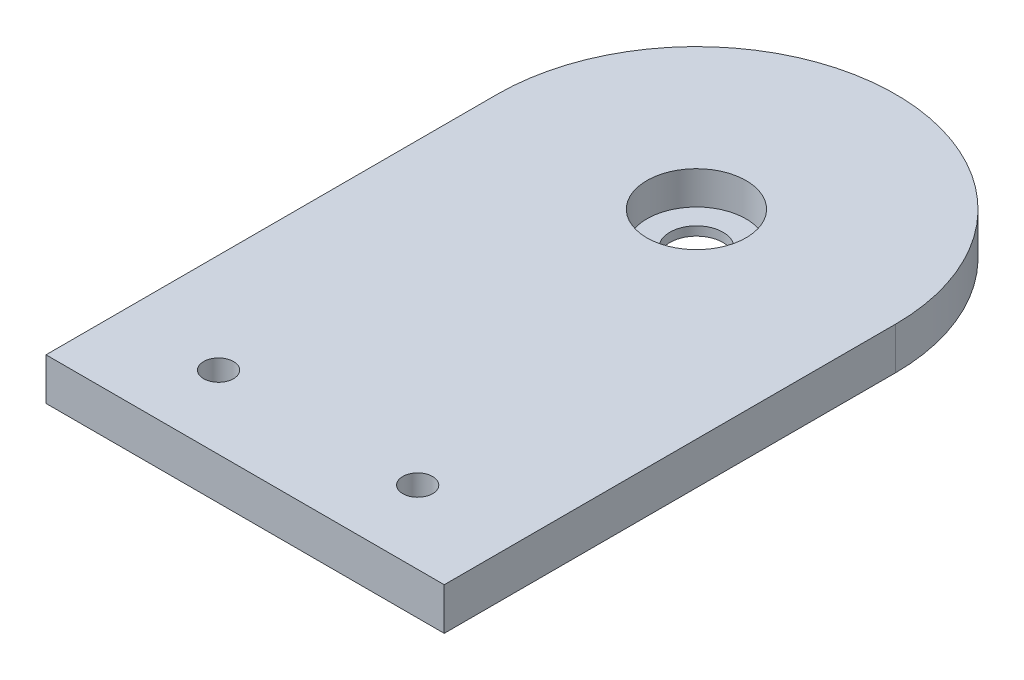
ISO-10303-21;
HEADER;
FILE_DESCRIPTION(('STEP AP214'),'2;1');
FILE_NAME('part.step','',(''),(''),'','','');
FILE_SCHEMA(('AUTOMOTIVE_DESIGN { 1 0 10303 214 1 1 1 1 }'));
ENDSEC;
DATA;
#1=APPLICATION_CONTEXT('core data for automotive mechanical design processes');
#2=APPLICATION_PROTOCOL_DEFINITION('international standard','automotive_design',2000,#1);
#3=PRODUCT_CONTEXT('',#1,'mechanical');
#4=PRODUCT('Part','Part','',(#3));
#5=PRODUCT_RELATED_PRODUCT_CATEGORY('part','',(#4));
#6=PRODUCT_DEFINITION_FORMATION('','',#4);
#7=PRODUCT_DEFINITION_CONTEXT('part definition',#1,'design');
#8=PRODUCT_DEFINITION('design','',#6,#7);
#9=PRODUCT_DEFINITION_SHAPE('','',#8);
#10=(LENGTH_UNIT() NAMED_UNIT(*) SI_UNIT(.MILLI.,.METRE.));
#11=(NAMED_UNIT(*) PLANE_ANGLE_UNIT() SI_UNIT($,.RADIAN.));
#12=(NAMED_UNIT(*) SI_UNIT($,.STERADIAN.) SOLID_ANGLE_UNIT());
#13=UNCERTAINTY_MEASURE_WITH_UNIT(LENGTH_MEASURE(1.E-05),#10,'distance_accuracy_value','');
#14=(GEOMETRIC_REPRESENTATION_CONTEXT(3) GLOBAL_UNCERTAINTY_ASSIGNED_CONTEXT((#13)) GLOBAL_UNIT_ASSIGNED_CONTEXT((#10,
#11,#12)) REPRESENTATION_CONTEXT('',''));
#15=CARTESIAN_POINT('',(0.,0.,0.));
#16=DIRECTION('',(0.,0.,1.));
#17=DIRECTION('',(1.,0.,0.));
#18=AXIS2_PLACEMENT_3D('',#15,#16,#17);
#19=CARTESIAN_POINT('',(30.,-59.75,379.));
#20=DIRECTION('',(-1.,0.,0.));
#21=DIRECTION('',(0.,0.,1.));
#22=AXIS2_PLACEMENT_3D('',#19,#20,#21);
#23=PLANE('',#22);
#24=DIRECTION('',(0.,0.,-1.));
#25=VECTOR('',#24,1.);
#26=CARTESIAN_POINT('',(30.,-66.1,379.));
#27=LINE('',#26,#25);
#28=CARTESIAN_POINT('',(30.,-66.1,398.));
#29=VERTEX_POINT('',#28);
#30=CARTESIAN_POINT('',(30.,-66.1,330.));
#31=VERTEX_POINT('',#30);
#32=EDGE_CURVE('E122',#29,#31,#27,.T.);
#33=ORIENTED_EDGE('',*,*,#32,.T.);
#34=DIRECTION('',(0.,-1.,0.));
#35=VECTOR('',#34,1.);
#36=CARTESIAN_POINT('',(30.,-59.75,330.));
#37=LINE('',#36,#35);
#38=CARTESIAN_POINT('',(30.,-59.75,330.));
#39=VERTEX_POINT('',#38);
#40=EDGE_CURVE('E11',#39,#31,#37,.T.);
#41=ORIENTED_EDGE('',*,*,#40,.F.);
#42=DIRECTION('',(0.,0.,-1.));
#43=VECTOR('',#42,1.);
#44=CARTESIAN_POINT('',(30.,-59.75,379.));
#45=LINE('',#44,#43);
#46=CARTESIAN_POINT('',(30.,-59.75,398.));
#47=VERTEX_POINT('',#46);
#48=EDGE_CURVE('E82',#47,#39,#45,.T.);
#49=ORIENTED_EDGE('',*,*,#48,.F.);
#50=DIRECTION('',(0.,-1.,0.));
#51=VECTOR('',#50,1.);
#52=CARTESIAN_POINT('',(30.,-59.75,398.));
#53=LINE('',#52,#51);
#54=EDGE_CURVE('E98',#47,#29,#53,.T.);
#55=ORIENTED_EDGE('',*,*,#54,.T.);
#56=EDGE_LOOP('',(#33,#41,#49,#55));
#57=FACE_BOUND('',#56,.T.);
#58=ADVANCED_FACE('F39',(#57),#23,.F.);
#59=CARTESIAN_POINT('',(-30.,-59.75,379.));
#60=DIRECTION('',(1.,0.,0.));
#61=DIRECTION('',(0.,0.,-1.));
#62=AXIS2_PLACEMENT_3D('',#59,#60,#61);
#63=PLANE('',#62);
#64=DIRECTION('',(0.,0.,1.));
#65=VECTOR('',#64,1.);
#66=CARTESIAN_POINT('',(-30.,-66.1,379.));
#67=LINE('',#66,#65);
#68=CARTESIAN_POINT('',(-30.,-66.1,330.));
#69=VERTEX_POINT('',#68);
#70=CARTESIAN_POINT('',(-30.,-66.1,398.));
#71=VERTEX_POINT('',#70);
#72=EDGE_CURVE('E93',#69,#71,#67,.T.);
#73=ORIENTED_EDGE('',*,*,#72,.T.);
#74=DIRECTION('',(0.,-1.,0.));
#75=VECTOR('',#74,1.);
#76=CARTESIAN_POINT('',(-30.,-59.75,398.));
#77=LINE('',#76,#75);
#78=CARTESIAN_POINT('',(-30.,-59.75,398.));
#79=VERTEX_POINT('',#78);
#80=EDGE_CURVE('E87',#79,#71,#77,.T.);
#81=ORIENTED_EDGE('',*,*,#80,.F.);
#82=DIRECTION('',(0.,0.,1.));
#83=VECTOR('',#82,1.);
#84=CARTESIAN_POINT('',(-30.,-59.75,379.));
#85=LINE('',#84,#83);
#86=CARTESIAN_POINT('',(-30.,-59.75,330.));
#87=VERTEX_POINT('',#86);
#88=EDGE_CURVE('E77',#87,#79,#85,.T.);
#89=ORIENTED_EDGE('',*,*,#88,.F.);
#90=DIRECTION('',(0.,-1.,0.));
#91=VECTOR('',#90,1.);
#92=CARTESIAN_POINT('',(-30.,-59.75,330.));
#93=LINE('',#92,#91);
#94=EDGE_CURVE('E46',#87,#69,#93,.T.);
#95=ORIENTED_EDGE('',*,*,#94,.T.);
#96=EDGE_LOOP('',(#73,#81,#89,#95));
#97=FACE_BOUND('',#96,.T.);
#98=ADVANCED_FACE('F90',(#97),#63,.F.);
#99=CARTESIAN_POINT('',(0.,-59.75,0.));
#100=DIRECTION('',(0.,-1.,0.));
#101=DIRECTION('',(0.,0.,-1.));
#102=AXIS2_PLACEMENT_3D('',#99,#100,#101);
#103=PLANE('',#102);
#104=CARTESIAN_POINT('',(-15.,-59.75,387.));
#105=DIRECTION('',(0.,1.,0.));
#106=DIRECTION('',(0.,0.,1.));
#107=AXIS2_PLACEMENT_3D('',#104,#105,#106);
#108=CIRCLE('',#107,2.25);
#109=CARTESIAN_POINT('',(-15.,-59.75,389.25));
#110=VERTEX_POINT('',#109);
#111=EDGE_CURVE('E101',#110,#110,#108,.T.);
#112=ORIENTED_EDGE('',*,*,#111,.F.);
#113=EDGE_LOOP('',(#112));
#114=FACE_BOUND('',#113,.T.);
#115=CARTESIAN_POINT('',(15.,-59.75,387.));
#116=DIRECTION('',(0.,1.,0.));
#117=DIRECTION('',(0.,0.,1.));
#118=AXIS2_PLACEMENT_3D('',#115,#116,#117);
#119=CIRCLE('',#118,2.25);
#120=CARTESIAN_POINT('',(15.,-59.75,389.25));
#121=VERTEX_POINT('',#120);
#122=EDGE_CURVE('E106',#121,#121,#119,.T.);
#123=ORIENTED_EDGE('',*,*,#122,.F.);
#124=EDGE_LOOP('',(#123));
#125=FACE_BOUND('',#124,.T.);
#126=CARTESIAN_POINT('',(0.,-59.75,330.));
#127=DIRECTION('',(0.,1.,0.));
#128=DIRECTION('',(0.,0.,1.));
#129=AXIS2_PLACEMENT_3D('',#126,#127,#128);
#130=CIRCLE('',#129,7.475);
#131=CARTESIAN_POINT('',(0.,-59.75,337.475));
#132=VERTEX_POINT('',#131);
#133=EDGE_CURVE('E114',#132,#132,#130,.T.);
#134=ORIENTED_EDGE('',*,*,#133,.F.);
#135=EDGE_LOOP('',(#134));
#136=FACE_BOUND('',#135,.T.);
#137=ORIENTED_EDGE('',*,*,#48,.T.);
#138=CARTESIAN_POINT('',(0.,-59.75,330.));
#139=DIRECTION('',(0.,1.,0.));
#140=DIRECTION('',(0.,0.,1.));
#141=AXIS2_PLACEMENT_3D('',#138,#139,#140);
#142=CIRCLE('',#141,30.);
#143=EDGE_CURVE('E85',#39,#87,#142,.T.);
#144=ORIENTED_EDGE('',*,*,#143,.T.);
#145=ORIENTED_EDGE('',*,*,#88,.T.);
#146=DIRECTION('',(1.,0.,0.));
#147=VECTOR('',#146,1.);
#148=CARTESIAN_POINT('',(-30.,-59.75,398.));
#149=LINE('',#148,#147);
#150=EDGE_CURVE('E84',#79,#47,#149,.T.);
#151=ORIENTED_EDGE('',*,*,#150,.T.);
#152=EDGE_LOOP('',(#137,#144,#145,#151));
#153=FACE_BOUND('',#152,.T.);
#154=ADVANCED_FACE('F79',(#114,#125,#136,#153),#103,.F.);
#155=CARTESIAN_POINT('',(0.,-66.1,0.));
#156=DIRECTION('',(0.,-1.,0.));
#157=DIRECTION('',(0.,0.,-1.));
#158=AXIS2_PLACEMENT_3D('',#155,#156,#157);
#159=PLANE('',#158);
#160=CARTESIAN_POINT('',(-15.,-66.1,387.));
#161=DIRECTION('',(0.,1.,0.));
#162=DIRECTION('',(0.,0.,1.));
#163=AXIS2_PLACEMENT_3D('',#160,#161,#162);
#164=CIRCLE('',#163,2.25);
#165=CARTESIAN_POINT('',(-15.,-66.1,389.25));
#166=VERTEX_POINT('',#165);
#167=EDGE_CURVE('E173',#166,#166,#164,.T.);
#168=ORIENTED_EDGE('',*,*,#167,.T.);
#169=EDGE_LOOP('',(#168));
#170=FACE_BOUND('',#169,.T.);
#171=CARTESIAN_POINT('',(15.,-66.1,387.));
#172=DIRECTION('',(0.,1.,0.));
#173=DIRECTION('',(0.,0.,1.));
#174=AXIS2_PLACEMENT_3D('',#171,#172,#173);
#175=CIRCLE('',#174,2.25);
#176=CARTESIAN_POINT('',(15.,-66.1,389.25));
#177=VERTEX_POINT('',#176);
#178=EDGE_CURVE('E172',#177,#177,#175,.T.);
#179=ORIENTED_EDGE('',*,*,#178,.T.);
#180=EDGE_LOOP('',(#179));
#181=FACE_BOUND('',#180,.T.);
#182=CARTESIAN_POINT('',(0.,-66.1,330.));
#183=DIRECTION('',(0.,1.,0.));
#184=DIRECTION('',(0.,0.,1.));
#185=AXIS2_PLACEMENT_3D('',#182,#183,#184);
#186=CIRCLE('',#185,4.);
#187=CARTESIAN_POINT('',(0.,-66.1,326.));
#188=VERTEX_POINT('',#187);
#189=EDGE_CURVE('E91',#188,#188,#186,.T.);
#190=ORIENTED_EDGE('',*,*,#189,.T.);
#191=EDGE_LOOP('',(#190));
#192=FACE_BOUND('',#191,.T.);
#193=ORIENTED_EDGE('',*,*,#72,.F.);
#194=CARTESIAN_POINT('',(0.,-66.1,330.));
#195=DIRECTION('',(0.,1.,0.));
#196=DIRECTION('',(0.,0.,1.));
#197=AXIS2_PLACEMENT_3D('',#194,#195,#196);
#198=CIRCLE('',#197,30.);
#199=EDGE_CURVE('E55',#31,#69,#198,.T.);
#200=ORIENTED_EDGE('',*,*,#199,.F.);
#201=ORIENTED_EDGE('',*,*,#32,.F.);
#202=DIRECTION('',(1.,0.,0.));
#203=VECTOR('',#202,1.);
#204=CARTESIAN_POINT('',(-30.,-66.1,398.));
#205=LINE('',#204,#203);
#206=EDGE_CURVE('E99',#71,#29,#205,.T.);
#207=ORIENTED_EDGE('',*,*,#206,.F.);
#208=EDGE_LOOP('',(#193,#200,#201,#207));
#209=FACE_BOUND('',#208,.T.);
#210=ADVANCED_FACE('F126',(#170,#181,#192,#209),#159,.T.);
#211=CARTESIAN_POINT('',(0.,-59.75,330.));
#212=DIRECTION('',(0.,-1.,0.));
#213=DIRECTION('',(0.,0.,-1.));
#214=AXIS2_PLACEMENT_3D('',#211,#212,#213);
#215=CYLINDRICAL_SURFACE('',#214,30.);
#216=ORIENTED_EDGE('',*,*,#143,.F.);
#217=ORIENTED_EDGE('',*,*,#40,.T.);
#218=ORIENTED_EDGE('',*,*,#199,.T.);
#219=ORIENTED_EDGE('',*,*,#94,.F.);
#220=EDGE_LOOP('',(#216,#217,#218,#219));
#221=FACE_BOUND('',#220,.T.);
#222=ADVANCED_FACE('F145',(#221),#215,.T.);
#223=CARTESIAN_POINT('',(0.,-59.75,330.));
#224=DIRECTION('',(0.,-1.,0.));
#225=DIRECTION('',(0.,0.,-1.));
#226=AXIS2_PLACEMENT_3D('',#223,#224,#225);
#227=CYLINDRICAL_SURFACE('',#226,7.475);
#228=ORIENTED_EDGE('',*,*,#133,.T.);
#229=EDGE_LOOP('',(#228));
#230=FACE_BOUND('',#229,.T.);
#231=CARTESIAN_POINT('',(0.,-64.75,330.));
#232=DIRECTION('',(0.,1.,0.));
#233=DIRECTION('',(0.,0.,1.));
#234=AXIS2_PLACEMENT_3D('',#231,#232,#233);
#235=CIRCLE('',#234,7.475);
#236=CARTESIAN_POINT('',(0.,-64.75,337.475));
#237=VERTEX_POINT('',#236);
#238=EDGE_CURVE('E115',#237,#237,#235,.T.);
#239=ORIENTED_EDGE('',*,*,#238,.F.);
#240=EDGE_LOOP('',(#239));
#241=FACE_BOUND('',#240,.T.);
#242=ADVANCED_FACE('F146',(#230,#241),#227,.F.);
#243=CARTESIAN_POINT('',(0.,-64.75,330.));
#244=DIRECTION('',(0.,1.,0.));
#245=DIRECTION('',(0.,0.,1.));
#246=AXIS2_PLACEMENT_3D('',#243,#244,#245);
#247=PLANE('',#246);
#248=CARTESIAN_POINT('',(0.,-64.75,330.));
#249=DIRECTION('',(0.,1.,0.));
#250=DIRECTION('',(0.,0.,1.));
#251=AXIS2_PLACEMENT_3D('',#248,#249,#250);
#252=CIRCLE('',#251,4.);
#253=CARTESIAN_POINT('',(0.,-64.75,326.));
#254=VERTEX_POINT('',#253);
#255=EDGE_CURVE('E107',#254,#254,#252,.T.);
#256=ORIENTED_EDGE('',*,*,#255,.F.);
#257=EDGE_LOOP('',(#256));
#258=FACE_BOUND('',#257,.T.);
#259=ORIENTED_EDGE('',*,*,#238,.T.);
#260=EDGE_LOOP('',(#259));
#261=FACE_BOUND('',#260,.T.);
#262=ADVANCED_FACE('F147',(#258,#261),#247,.T.);
#263=CARTESIAN_POINT('',(0.,-64.75,330.));
#264=DIRECTION('',(0.,-1.,0.));
#265=DIRECTION('',(0.,0.,-1.));
#266=AXIS2_PLACEMENT_3D('',#263,#264,#265);
#267=CYLINDRICAL_SURFACE('',#266,4.);
#268=CARTESIAN_POINT('',(0.,-64.75,326.));
#269=CARTESIAN_POINT('',(0.,-64.7640625,326.));
#270=CARTESIAN_POINT('',(0.,-64.778125,326.));
#271=CARTESIAN_POINT('',(0.,-64.80625,326.));
#272=CARTESIAN_POINT('',(0.,-64.8203125,326.));
#273=CARTESIAN_POINT('',(0.,-64.8484375,326.));
#274=CARTESIAN_POINT('',(0.,-64.8625,326.));
#275=CARTESIAN_POINT('',(0.,-64.890625,326.));
#276=CARTESIAN_POINT('',(0.,-64.9046875,326.));
#277=CARTESIAN_POINT('',(0.,-64.9328125,326.));
#278=CARTESIAN_POINT('',(0.,-64.946875,326.));
#279=CARTESIAN_POINT('',(0.,-64.975,326.));
#280=CARTESIAN_POINT('',(0.,-64.9890625,326.));
#281=CARTESIAN_POINT('',(0.,-65.0171875,326.));
#282=CARTESIAN_POINT('',(0.,-65.03125,326.));
#283=CARTESIAN_POINT('',(0.,-65.059375,326.));
#284=CARTESIAN_POINT('',(0.,-65.0734375,326.));
#285=CARTESIAN_POINT('',(0.,-65.1015625,326.));
#286=CARTESIAN_POINT('',(0.,-65.115625,326.));
#287=CARTESIAN_POINT('',(0.,-65.14375,326.));
#288=CARTESIAN_POINT('',(0.,-65.1578125,326.));
#289=CARTESIAN_POINT('',(0.,-65.1859375,326.));
#290=CARTESIAN_POINT('',(0.,-65.2,326.));
#291=CARTESIAN_POINT('',(0.,-65.228125,326.));
#292=CARTESIAN_POINT('',(0.,-65.2421875,326.));
#293=CARTESIAN_POINT('',(0.,-65.2703125,326.));
#294=CARTESIAN_POINT('',(0.,-65.284375,326.));
#295=CARTESIAN_POINT('',(0.,-65.3125,326.));
#296=CARTESIAN_POINT('',(0.,-65.3265625,326.));
#297=CARTESIAN_POINT('',(0.,-65.3546875,326.));
#298=CARTESIAN_POINT('',(0.,-65.36875,326.));
#299=CARTESIAN_POINT('',(0.,-65.396875,326.));
#300=CARTESIAN_POINT('',(0.,-65.4109375,326.));
#301=CARTESIAN_POINT('',(0.,-65.4390625,326.));
#302=CARTESIAN_POINT('',(0.,-65.453125,326.));
#303=CARTESIAN_POINT('',(0.,-65.48125,326.));
#304=CARTESIAN_POINT('',(0.,-65.4953125,326.));
#305=CARTESIAN_POINT('',(0.,-65.5234375,326.));
#306=CARTESIAN_POINT('',(0.,-65.5375,326.));
#307=CARTESIAN_POINT('',(0.,-65.565625,326.));
#308=CARTESIAN_POINT('',(0.,-65.5796875,326.));
#309=CARTESIAN_POINT('',(0.,-65.6078125,326.));
#310=CARTESIAN_POINT('',(0.,-65.621875,326.));
#311=CARTESIAN_POINT('',(0.,-65.65,326.));
#312=CARTESIAN_POINT('',(0.,-65.6640625,326.));
#313=CARTESIAN_POINT('',(0.,-65.6921875,326.));
#314=CARTESIAN_POINT('',(0.,-65.70625,326.));
#315=CARTESIAN_POINT('',(0.,-65.734375,326.));
#316=CARTESIAN_POINT('',(0.,-65.7484375,326.));
#317=CARTESIAN_POINT('',(0.,-65.7765625,326.));
#318=CARTESIAN_POINT('',(0.,-65.790625,326.));
#319=CARTESIAN_POINT('',(0.,-65.81875,326.));
#320=CARTESIAN_POINT('',(0.,-65.8328125,326.));
#321=CARTESIAN_POINT('',(0.,-65.8609375,326.));
#322=CARTESIAN_POINT('',(0.,-65.875,326.));
#323=CARTESIAN_POINT('',(0.,-65.903125,326.));
#324=CARTESIAN_POINT('',(0.,-65.9171875,326.));
#325=CARTESIAN_POINT('',(0.,-65.9453125,326.));
#326=CARTESIAN_POINT('',(0.,-65.959375,326.));
#327=CARTESIAN_POINT('',(0.,-65.9875,326.));
#328=CARTESIAN_POINT('',(0.,-66.0015625,326.));
#329=CARTESIAN_POINT('',(0.,-66.0296875,326.));
#330=CARTESIAN_POINT('',(0.,-66.04375,326.));
#331=CARTESIAN_POINT('',(0.,-66.071875,326.));
#332=CARTESIAN_POINT('',(0.,-66.0859375,326.));
#333=CARTESIAN_POINT('',(0.,-66.1,326.));
#334=B_SPLINE_CURVE_WITH_KNOTS('',3,(#268,#269,#270,#271,#272,#273,#274,#275,#276,#277,#278,
#279,#280,#281,#282,#283,#284,#285,#286,#287,#288,#289,#290,#291,#292,#293,#294,#295,#296,#297,
#298,#299,#300,#301,#302,#303,#304,#305,#306,#307,#308,#309,#310,#311,#312,#313,#314,#315,#316,
#317,#318,#319,#320,#321,#322,#323,#324,#325,#326,#327,#328,#329,#330,#331,#332,#333),
.UNSPECIFIED.,.F.,.F.,(4,2,2,2,2,2,2,2,2,2,2,2,2,2,2,2,2,2,2,2,2,2,2,2,2,2,2,2,2,2,2,2,4),(0.,
0.0421874999999988,0.0843749999999976,0.126562499999996,0.168749999999995,0.210937499999994,
0.253124999999993,0.295312499999992,0.337499999999991,0.379687499999989,0.421874999999988,
0.464062500000001,0.50625,0.548437499999999,0.590624999999997,0.632812499999996,
0.674999999999995,0.717187499999994,0.759374999999993,0.801562499999992,0.84374999999999,
0.885937499999989,0.928125000000002,0.970312500000001,1.0125,1.0546875,1.096875,1.1390625,
1.18124999999999,1.22343749999999,1.26562499999999,1.30781249999999,1.35),.UNSPECIFIED.);
#335=EDGE_CURVE('BSEAM155',#254,#188,#334,.T.);
#336=ORIENTED_EDGE('',*,*,#255,.T.);
#337=ORIENTED_EDGE('',*,*,#189,.F.);
#338=ORIENTED_EDGE('',*,*,#335,.T.);
#339=ORIENTED_EDGE('',*,*,#335,.F.);
#340=EDGE_LOOP('',(#336,#338,#337,#339));
#341=FACE_BOUND('',#340,.T.);
#342=ADVANCED_FACE('F155',(#341),#267,.F.);
#343=CARTESIAN_POINT('',(-30.,-59.75,398.));
#344=DIRECTION('',(0.,0.,-1.));
#345=DIRECTION('',(-1.,0.,0.));
#346=AXIS2_PLACEMENT_3D('',#343,#344,#345);
#347=PLANE('',#346);
#348=ORIENTED_EDGE('',*,*,#206,.T.);
#349=ORIENTED_EDGE('',*,*,#54,.F.);
#350=ORIENTED_EDGE('',*,*,#150,.F.);
#351=ORIENTED_EDGE('',*,*,#80,.T.);
#352=EDGE_LOOP('',(#348,#349,#350,#351));
#353=FACE_BOUND('',#352,.T.);
#354=ADVANCED_FACE('F96',(#353),#347,.F.);
#355=CARTESIAN_POINT('',(15.,-59.75,387.));
#356=DIRECTION('',(0.,-1.,0.));
#357=DIRECTION('',(0.,0.,-1.));
#358=AXIS2_PLACEMENT_3D('',#355,#356,#357);
#359=CYLINDRICAL_SURFACE('',#358,2.25);
#360=ORIENTED_EDGE('',*,*,#122,.T.);
#361=EDGE_LOOP('',(#360));
#362=FACE_BOUND('',#361,.T.);
#363=ORIENTED_EDGE('',*,*,#178,.F.);
#364=EDGE_LOOP('',(#363));
#365=FACE_BOUND('',#364,.T.);
#366=ADVANCED_FACE('F160',(#362,#365),#359,.F.);
#367=CARTESIAN_POINT('',(-15.,-59.75,387.));
#368=DIRECTION('',(0.,-1.,0.));
#369=DIRECTION('',(0.,0.,-1.));
#370=AXIS2_PLACEMENT_3D('',#367,#368,#369);
#371=CYLINDRICAL_SURFACE('',#370,2.25);
#372=ORIENTED_EDGE('',*,*,#111,.T.);
#373=EDGE_LOOP('',(#372));
#374=FACE_BOUND('',#373,.T.);
#375=ORIENTED_EDGE('',*,*,#167,.F.);
#376=EDGE_LOOP('',(#375));
#377=FACE_BOUND('',#376,.T.);
#378=ADVANCED_FACE('F162',(#374,#377),#371,.F.);
#379=CLOSED_SHELL('',(#58,#98,#154,#210,#222,#242,#262,#342,#354,#366,#378));
#380=MANIFOLD_SOLID_BREP('B2',#379);
#381=ADVANCED_BREP_SHAPE_REPRESENTATION('',(#18,#380),#14);
#382=SHAPE_DEFINITION_REPRESENTATION(#9,#381);
ENDSEC;
END-ISO-10303-21;
